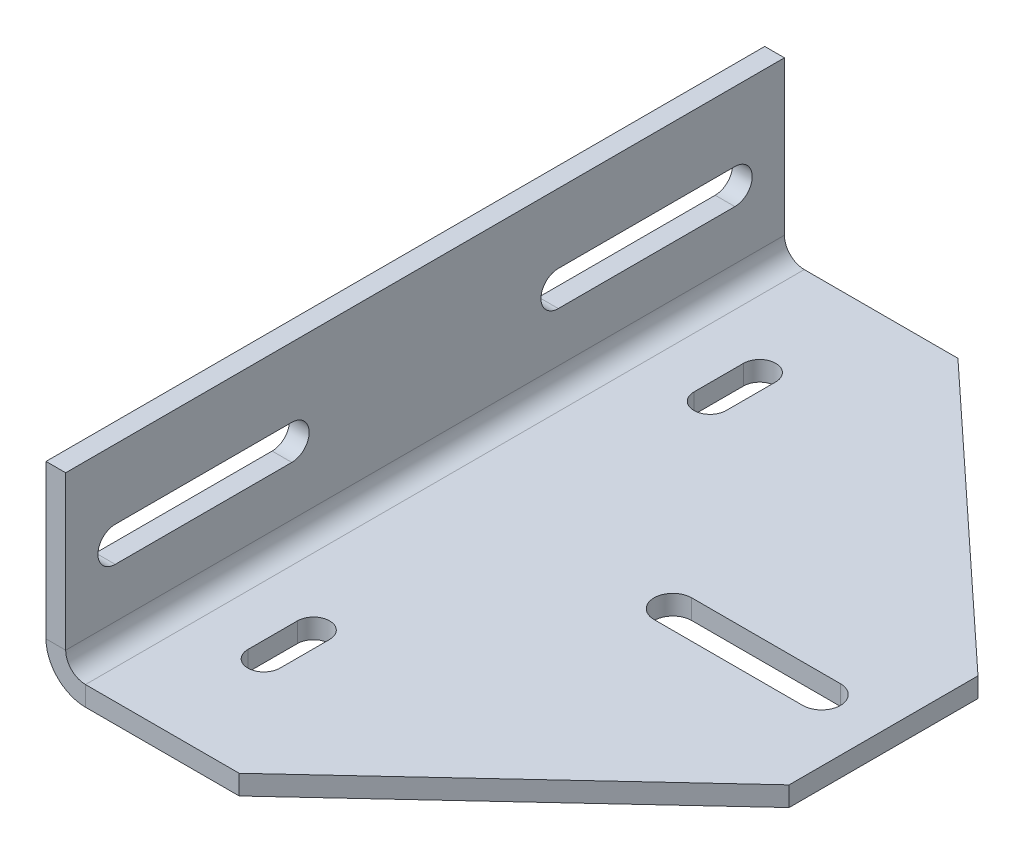
ISO-10303-21;
HEADER;
FILE_DESCRIPTION(('STEP AP214'),'2;1');
FILE_NAME('part.step','',(''),(''),'','','');
FILE_SCHEMA(('AUTOMOTIVE_DESIGN { 1 0 10303 214 1 1 1 1 }'));
ENDSEC;
DATA;
#1=APPLICATION_CONTEXT('core data for automotive mechanical design processes');
#2=APPLICATION_PROTOCOL_DEFINITION('international standard','automotive_design',2000,#1);
#3=PRODUCT_CONTEXT('',#1,'mechanical');
#4=PRODUCT('Part','Part','',(#3));
#5=PRODUCT_RELATED_PRODUCT_CATEGORY('part','',(#4));
#6=PRODUCT_DEFINITION_FORMATION('','',#4);
#7=PRODUCT_DEFINITION_CONTEXT('part definition',#1,'design');
#8=PRODUCT_DEFINITION('design','',#6,#7);
#9=PRODUCT_DEFINITION_SHAPE('','',#8);
#10=(LENGTH_UNIT() NAMED_UNIT(*) SI_UNIT(.MILLI.,.METRE.));
#11=(NAMED_UNIT(*) PLANE_ANGLE_UNIT() SI_UNIT($,.RADIAN.));
#12=(NAMED_UNIT(*) SI_UNIT($,.STERADIAN.) SOLID_ANGLE_UNIT());
#13=UNCERTAINTY_MEASURE_WITH_UNIT(LENGTH_MEASURE(1.E-05),#10,'distance_accuracy_value','');
#14=(GEOMETRIC_REPRESENTATION_CONTEXT(3) GLOBAL_UNCERTAINTY_ASSIGNED_CONTEXT((#13)) GLOBAL_UNIT_ASSIGNED_CONTEXT((#10,
#11,#12)) REPRESENTATION_CONTEXT('',''));
#15=CARTESIAN_POINT('',(0.,0.,0.));
#16=DIRECTION('',(0.,0.,1.));
#17=DIRECTION('',(1.,0.,0.));
#18=AXIS2_PLACEMENT_3D('',#15,#16,#17);
#19=CARTESIAN_POINT('',(-7.9375,49.9375,0.));
#20=DIRECTION('',(0.,1.,0.));
#21=DIRECTION('',(0.,0.,-1.));
#22=AXIS2_PLACEMENT_3D('',#19,#20,#21);
#23=PLANE('',#22);
#24=DIRECTION('',(-1.,0.,0.));
#25=VECTOR('',#24,1.);
#26=CARTESIAN_POINT('',(-7.9375,49.9375,53.7606549397505));
#27=LINE('',#26,#25);
#28=CARTESIAN_POINT('',(0.,49.9375,53.7606549397505));
#29=VERTEX_POINT('',#28);
#30=CARTESIAN_POINT('',(-7.9375,49.9375,53.7606549397505));
#31=VERTEX_POINT('',#30);
#32=EDGE_CURVE('E11',#29,#31,#27,.T.);
#33=ORIENTED_EDGE('',*,*,#32,.F.);
#34=DIRECTION('',(0.,0.,1.));
#35=VECTOR('',#34,1.);
#36=CARTESIAN_POINT('',(0.,49.9375,0.));
#37=LINE('',#36,#35);
#38=CARTESIAN_POINT('',(0.,49.9375,125.));
#39=VERTEX_POINT('',#38);
#40=EDGE_CURVE('E177',#39,#29,#37,.F.);
#41=ORIENTED_EDGE('',*,*,#40,.F.);
#42=DIRECTION('',(-1.,0.,0.));
#43=VECTOR('',#42,1.);
#44=CARTESIAN_POINT('',(-7.9375,49.9375,125.));
#45=LINE('',#44,#43);
#46=CARTESIAN_POINT('',(-7.9375,49.9375,125.));
#47=VERTEX_POINT('',#46);
#48=EDGE_CURVE('E51',#39,#47,#45,.T.);
#49=ORIENTED_EDGE('',*,*,#48,.T.);
#50=DIRECTION('',(0.,0.,-1.));
#51=VECTOR('',#50,1.);
#52=CARTESIAN_POINT('',(-7.9375,49.9375,0.));
#53=LINE('',#52,#51);
#54=EDGE_CURVE('E274',#47,#31,#53,.T.);
#55=ORIENTED_EDGE('',*,*,#54,.T.);
#56=EDGE_LOOP('',(#33,#41,#49,#55));
#57=FACE_BOUND('',#56,.T.);
#58=ADVANCED_FACE('F41',(#57),#23,.F.);
#59=CARTESIAN_POINT('',(-7.9375,42.9375,125.));
#60=DIRECTION('',(-1.,0.,0.));
#61=DIRECTION('',(0.,0.,1.));
#62=AXIS2_PLACEMENT_3D('',#59,#60,#61);
#63=CYLINDRICAL_SURFACE('',#62,6.99999999999997);
#64=ORIENTED_EDGE('',*,*,#48,.F.);
#65=CARTESIAN_POINT('',(0.,42.9375,125.));
#66=DIRECTION('',(-1.,0.,0.));
#67=DIRECTION('',(0.,0.,1.));
#68=AXIS2_PLACEMENT_3D('',#65,#66,#67);
#69=CIRCLE('',#68,6.99999999999997);
#70=CARTESIAN_POINT('',(0.,35.9375,125.));
#71=VERTEX_POINT('',#70);
#72=EDGE_CURVE('E190',#39,#71,#69,.F.);
#73=ORIENTED_EDGE('',*,*,#72,.T.);
#74=DIRECTION('',(-1.,0.,0.));
#75=VECTOR('',#74,1.);
#76=CARTESIAN_POINT('',(-7.9375,35.9375,125.));
#77=LINE('',#76,#75);
#78=CARTESIAN_POINT('',(-7.9375,35.9375,125.));
#79=VERTEX_POINT('',#78);
#80=EDGE_CURVE('E169',#71,#79,#77,.T.);
#81=ORIENTED_EDGE('',*,*,#80,.T.);
#82=CARTESIAN_POINT('',(-7.9375,42.9375,125.));
#83=DIRECTION('',(-1.,0.,0.));
#84=DIRECTION('',(0.,0.,1.));
#85=AXIS2_PLACEMENT_3D('',#82,#83,#84);
#86=CIRCLE('',#85,6.99999999999997);
#87=EDGE_CURVE('E282',#47,#79,#86,.F.);
#88=ORIENTED_EDGE('',*,*,#87,.F.);
#89=EDGE_LOOP('',(#64,#73,#81,#88));
#90=FACE_BOUND('',#89,.T.);
#91=ADVANCED_FACE('F284',(#90),#63,.F.);
#92=CARTESIAN_POINT('',(-7.9375,35.9374999999999,0.));
#93=DIRECTION('',(0.,1.,0.));
#94=DIRECTION('',(0.,0.,-1.));
#95=AXIS2_PLACEMENT_3D('',#92,#93,#94);
#96=PLANE('',#95);
#97=ORIENTED_EDGE('',*,*,#80,.F.);
#98=DIRECTION('',(0.,0.,1.));
#99=VECTOR('',#98,1.);
#100=CARTESIAN_POINT('',(0.,35.9375,0.));
#101=LINE('',#100,#99);
#102=CARTESIAN_POINT('',(0.,35.9375,53.7606549397505));
#103=VERTEX_POINT('',#102);
#104=EDGE_CURVE('E175',#71,#103,#101,.F.);
#105=ORIENTED_EDGE('',*,*,#104,.T.);
#106=DIRECTION('',(-1.,0.,0.));
#107=VECTOR('',#106,1.);
#108=CARTESIAN_POINT('',(-7.9375,35.9375,53.7606549397505));
#109=LINE('',#108,#107);
#110=CARTESIAN_POINT('',(-7.9375,35.9375,53.7606549397505));
#111=VERTEX_POINT('',#110);
#112=EDGE_CURVE('E45',#103,#111,#109,.T.);
#113=ORIENTED_EDGE('',*,*,#112,.T.);
#114=DIRECTION('',(0.,0.,-1.));
#115=VECTOR('',#114,1.);
#116=CARTESIAN_POINT('',(-7.9375,35.9374999999999,0.));
#117=LINE('',#116,#115);
#118=EDGE_CURVE('E539',#79,#111,#117,.T.);
#119=ORIENTED_EDGE('',*,*,#118,.F.);
#120=EDGE_LOOP('',(#97,#105,#113,#119));
#121=FACE_BOUND('',#120,.T.);
#122=ADVANCED_FACE('F179',(#121),#96,.T.);
#123=CARTESIAN_POINT('',(-7.9375,42.9375,-125.));
#124=DIRECTION('',(-1.,0.,0.));
#125=DIRECTION('',(0.,0.,1.));
#126=AXIS2_PLACEMENT_3D('',#123,#124,#125);
#127=CYLINDRICAL_SURFACE('',#126,6.99999999999997);
#128=DIRECTION('',(-1.,0.,0.));
#129=VECTOR('',#128,1.);
#130=CARTESIAN_POINT('',(-7.9375,35.9375,-125.));
#131=LINE('',#130,#129);
#132=CARTESIAN_POINT('',(0.,35.9375,-125.));
#133=VERTEX_POINT('',#132);
#134=CARTESIAN_POINT('',(-7.9375,35.9375,-125.));
#135=VERTEX_POINT('',#134);
#136=EDGE_CURVE('E170',#133,#135,#131,.T.);
#137=ORIENTED_EDGE('',*,*,#136,.F.);
#138=CARTESIAN_POINT('',(0.,42.9375,-125.));
#139=DIRECTION('',(-1.,0.,0.));
#140=DIRECTION('',(0.,0.,1.));
#141=AXIS2_PLACEMENT_3D('',#138,#139,#140);
#142=CIRCLE('',#141,6.99999999999997);
#143=CARTESIAN_POINT('',(0.,49.9375,-125.));
#144=VERTEX_POINT('',#143);
#145=EDGE_CURVE('E421',#144,#133,#142,.T.);
#146=ORIENTED_EDGE('',*,*,#145,.F.);
#147=DIRECTION('',(-1.,0.,0.));
#148=VECTOR('',#147,1.);
#149=CARTESIAN_POINT('',(-7.9375,49.9375,-125.));
#150=LINE('',#149,#148);
#151=CARTESIAN_POINT('',(-7.9375,49.9375,-125.));
#152=VERTEX_POINT('',#151);
#153=EDGE_CURVE('E262',#144,#152,#150,.T.);
#154=ORIENTED_EDGE('',*,*,#153,.T.);
#155=CARTESIAN_POINT('',(-7.9375,42.9375,-125.));
#156=DIRECTION('',(-1.,0.,0.));
#157=DIRECTION('',(0.,0.,1.));
#158=AXIS2_PLACEMENT_3D('',#155,#156,#157);
#159=CIRCLE('',#158,6.99999999999997);
#160=EDGE_CURVE('E544',#152,#135,#159,.T.);
#161=ORIENTED_EDGE('',*,*,#160,.T.);
#162=EDGE_LOOP('',(#137,#146,#154,#161));
#163=FACE_BOUND('',#162,.T.);
#164=ADVANCED_FACE('F556',(#163),#127,.F.);
#165=CARTESIAN_POINT('',(-7.9375,49.9375,0.));
#166=DIRECTION('',(0.,-1.,0.));
#167=DIRECTION('',(0.,0.,1.));
#168=AXIS2_PLACEMENT_3D('',#165,#166,#167);
#169=PLANE('',#168);
#170=ORIENTED_EDGE('',*,*,#153,.F.);
#171=DIRECTION('',(0.,0.,1.));
#172=VECTOR('',#171,1.);
#173=CARTESIAN_POINT('',(0.,49.9375,0.));
#174=LINE('',#173,#172);
#175=CARTESIAN_POINT('',(0.,49.9375,-53.7606549397505));
#176=VERTEX_POINT('',#175);
#177=EDGE_CURVE('E402',#144,#176,#174,.T.);
#178=ORIENTED_EDGE('',*,*,#177,.T.);
#179=DIRECTION('',(-1.,0.,0.));
#180=VECTOR('',#179,1.);
#181=CARTESIAN_POINT('',(-7.9375,49.9375,-53.7606549397505));
#182=LINE('',#181,#180);
#183=CARTESIAN_POINT('',(-7.9375,49.9375,-53.7606549397505));
#184=VERTEX_POINT('',#183);
#185=EDGE_CURVE('E259',#176,#184,#182,.T.);
#186=ORIENTED_EDGE('',*,*,#185,.T.);
#187=DIRECTION('',(0.,0.,1.));
#188=VECTOR('',#187,1.);
#189=CARTESIAN_POINT('',(-7.9375,49.9375,0.));
#190=LINE('',#189,#188);
#191=EDGE_CURVE('E441',#152,#184,#190,.T.);
#192=ORIENTED_EDGE('',*,*,#191,.F.);
#193=EDGE_LOOP('',(#170,#178,#186,#192));
#194=FACE_BOUND('',#193,.T.);
#195=ADVANCED_FACE('F439',(#194),#169,.T.);
#196=CARTESIAN_POINT('',(-7.9375,42.9375,-53.7606549397505));
#197=DIRECTION('',(-1.,0.,0.));
#198=DIRECTION('',(0.,0.,1.));
#199=AXIS2_PLACEMENT_3D('',#196,#197,#198);
#200=CYLINDRICAL_SURFACE('',#199,7.);
#201=ORIENTED_EDGE('',*,*,#185,.F.);
#202=CARTESIAN_POINT('',(0.,42.9375,-53.7606549397505));
#203=DIRECTION('',(-1.,0.,0.));
#204=DIRECTION('',(0.,0.,1.));
#205=AXIS2_PLACEMENT_3D('',#202,#203,#204);
#206=CIRCLE('',#205,7.);
#207=CARTESIAN_POINT('',(0.,35.9375,-53.7606549397505));
#208=VERTEX_POINT('',#207);
#209=EDGE_CURVE('E398',#208,#176,#206,.T.);
#210=ORIENTED_EDGE('',*,*,#209,.F.);
#211=DIRECTION('',(-1.,0.,0.));
#212=VECTOR('',#211,1.);
#213=CARTESIAN_POINT('',(-7.9375,35.9375,-53.7606549397505));
#214=LINE('',#213,#212);
#215=CARTESIAN_POINT('',(-7.9375,35.9375,-53.7606549397505));
#216=VERTEX_POINT('',#215);
#217=EDGE_CURVE('E256',#208,#216,#214,.T.);
#218=ORIENTED_EDGE('',*,*,#217,.T.);
#219=CARTESIAN_POINT('',(-7.9375,42.9375,-53.7606549397505));
#220=DIRECTION('',(-1.,0.,0.));
#221=DIRECTION('',(0.,0.,1.));
#222=AXIS2_PLACEMENT_3D('',#219,#220,#221);
#223=CIRCLE('',#222,7.);
#224=EDGE_CURVE('E350',#216,#184,#223,.T.);
#225=ORIENTED_EDGE('',*,*,#224,.T.);
#226=EDGE_LOOP('',(#201,#210,#218,#225));
#227=FACE_BOUND('',#226,.T.);
#228=ADVANCED_FACE('F432',(#227),#200,.F.);
#229=CARTESIAN_POINT('',(28.5,0.,0.));
#230=DIRECTION('',(-1.,0.,0.));
#231=DIRECTION('',(0.,0.,1.));
#232=AXIS2_PLACEMENT_3D('',#229,#230,#231);
#233=PLANE('',#232);
#234=DIRECTION('',(0.,-1.,0.));
#235=VECTOR('',#234,1.);
#236=CARTESIAN_POINT('',(28.5,0.,-100.));
#237=LINE('',#236,#235);
#238=CARTESIAN_POINT('',(28.5,7.9375,-100.));
#239=VERTEX_POINT('',#238);
#240=CARTESIAN_POINT('',(28.5,0.,-100.));
#241=VERTEX_POINT('',#240);
#242=EDGE_CURVE('E253',#239,#241,#237,.T.);
#243=ORIENTED_EDGE('',*,*,#242,.F.);
#244=DIRECTION('',(0.,0.,1.));
#245=VECTOR('',#244,1.);
#246=CARTESIAN_POINT('',(28.5,7.9375,0.));
#247=LINE('',#246,#245);
#248=CARTESIAN_POINT('',(28.5,7.9375,-80.));
#249=VERTEX_POINT('',#248);
#250=EDGE_CURVE('E413',#239,#249,#247,.T.);
#251=ORIENTED_EDGE('',*,*,#250,.T.);
#252=DIRECTION('',(0.,-1.,0.));
#253=VECTOR('',#252,1.);
#254=CARTESIAN_POINT('',(28.5,0.,-80.));
#255=LINE('',#254,#253);
#256=CARTESIAN_POINT('',(28.5,0.,-80.));
#257=VERTEX_POINT('',#256);
#258=EDGE_CURVE('E250',#249,#257,#255,.T.);
#259=ORIENTED_EDGE('',*,*,#258,.T.);
#260=DIRECTION('',(0.,0.,1.));
#261=VECTOR('',#260,1.);
#262=CARTESIAN_POINT('',(28.5,0.,0.));
#263=LINE('',#262,#261);
#264=EDGE_CURVE('E333',#241,#257,#263,.T.);
#265=ORIENTED_EDGE('',*,*,#264,.F.);
#266=EDGE_LOOP('',(#243,#251,#259,#265));
#267=FACE_BOUND('',#266,.T.);
#268=ADVANCED_FACE('F648',(#267),#233,.F.);
#269=CARTESIAN_POINT('',(35.,0.,-80.));
#270=DIRECTION('',(0.,1.,0.));
#271=DIRECTION('',(0.,0.,1.));
#272=AXIS2_PLACEMENT_3D('',#269,#270,#271);
#273=CYLINDRICAL_SURFACE('',#272,6.49999999999998);
#274=ORIENTED_EDGE('',*,*,#258,.F.);
#275=CARTESIAN_POINT('',(35.,7.9375,-80.));
#276=DIRECTION('',(0.,1.,0.));
#277=DIRECTION('',(0.,0.,1.));
#278=AXIS2_PLACEMENT_3D('',#275,#276,#277);
#279=CIRCLE('',#278,6.49999999999998);
#280=CARTESIAN_POINT('',(41.5,7.9375,-80.));
#281=VERTEX_POINT('',#280);
#282=EDGE_CURVE('E356',#281,#249,#279,.F.);
#283=ORIENTED_EDGE('',*,*,#282,.F.);
#284=DIRECTION('',(0.,-1.,0.));
#285=VECTOR('',#284,1.);
#286=CARTESIAN_POINT('',(41.5,0.,-80.));
#287=LINE('',#286,#285);
#288=CARTESIAN_POINT('',(41.5,0.,-80.));
#289=VERTEX_POINT('',#288);
#290=EDGE_CURVE('E247',#281,#289,#287,.T.);
#291=ORIENTED_EDGE('',*,*,#290,.T.);
#292=CARTESIAN_POINT('',(35.,0.,-80.));
#293=DIRECTION('',(0.,1.,0.));
#294=DIRECTION('',(0.,0.,1.));
#295=AXIS2_PLACEMENT_3D('',#292,#293,#294);
#296=CIRCLE('',#295,6.49999999999998);
#297=EDGE_CURVE('E336',#289,#257,#296,.F.);
#298=ORIENTED_EDGE('',*,*,#297,.T.);
#299=EDGE_LOOP('',(#274,#283,#291,#298));
#300=FACE_BOUND('',#299,.T.);
#301=ADVANCED_FACE('F644',(#300),#273,.F.);
#302=CARTESIAN_POINT('',(41.5,0.,0.));
#303=DIRECTION('',(-1.,0.,0.));
#304=DIRECTION('',(0.,0.,1.));
#305=AXIS2_PLACEMENT_3D('',#302,#303,#304);
#306=PLANE('',#305);
#307=ORIENTED_EDGE('',*,*,#290,.F.);
#308=DIRECTION('',(0.,0.,1.));
#309=VECTOR('',#308,1.);
#310=CARTESIAN_POINT('',(41.5,7.9375,0.));
#311=LINE('',#310,#309);
#312=CARTESIAN_POINT('',(41.5,7.9375,-100.));
#313=VERTEX_POINT('',#312);
#314=EDGE_CURVE('E387',#313,#281,#311,.T.);
#315=ORIENTED_EDGE('',*,*,#314,.F.);
#316=DIRECTION('',(0.,-1.,0.));
#317=VECTOR('',#316,1.);
#318=CARTESIAN_POINT('',(41.5,0.,-100.));
#319=LINE('',#318,#317);
#320=CARTESIAN_POINT('',(41.5,0.,-100.));
#321=VERTEX_POINT('',#320);
#322=EDGE_CURVE('E245',#313,#321,#319,.T.);
#323=ORIENTED_EDGE('',*,*,#322,.T.);
#324=DIRECTION('',(0.,0.,1.));
#325=VECTOR('',#324,1.);
#326=CARTESIAN_POINT('',(41.5,0.,0.));
#327=LINE('',#326,#325);
#328=EDGE_CURVE('E327',#321,#289,#327,.T.);
#329=ORIENTED_EDGE('',*,*,#328,.T.);
#330=EDGE_LOOP('',(#307,#315,#323,#329));
#331=FACE_BOUND('',#330,.T.);
#332=ADVANCED_FACE('F638',(#331),#306,.T.);
#333=CARTESIAN_POINT('',(-7.9375,0.,145.));
#334=DIRECTION('',(0.,0.,1.));
#335=DIRECTION('',(0.,1.,0.));
#336=AXIS2_PLACEMENT_3D('',#333,#334,#335);
#337=PLANE('',#336);
#338=DIRECTION('',(-1.,0.,0.));
#339=VECTOR('',#338,1.);
#340=CARTESIAN_POINT('',(-7.9375,15.9375,145.));
#341=LINE('',#340,#339);
#342=CARTESIAN_POINT('',(0.,15.9375,145.));
#343=VERTEX_POINT('',#342);
#344=CARTESIAN_POINT('',(-7.9375,15.9375,145.));
#345=VERTEX_POINT('',#344);
#346=EDGE_CURVE('E242',#343,#345,#341,.T.);
#347=ORIENTED_EDGE('',*,*,#346,.F.);
#348=DIRECTION('',(0.,1.,0.));
#349=VECTOR('',#348,1.);
#350=CARTESIAN_POINT('',(0.,0.,145.));
#351=LINE('',#350,#349);
#352=CARTESIAN_POINT('',(0.,77.9375,145.));
#353=VERTEX_POINT('',#352);
#354=EDGE_CURVE('E184',#343,#353,#351,.T.);
#355=ORIENTED_EDGE('',*,*,#354,.T.);
#356=DIRECTION('',(-1.,0.,0.));
#357=VECTOR('',#356,1.);
#358=CARTESIAN_POINT('',(-7.9375,77.9375,145.));
#359=LINE('',#358,#357);
#360=CARTESIAN_POINT('',(-7.9375,77.9375,145.));
#361=VERTEX_POINT('',#360);
#362=EDGE_CURVE('E239',#353,#361,#359,.T.);
#363=ORIENTED_EDGE('',*,*,#362,.T.);
#364=DIRECTION('',(0.,1.,0.));
#365=VECTOR('',#364,1.);
#366=CARTESIAN_POINT('',(-7.9375,0.,145.));
#367=LINE('',#366,#365);
#368=EDGE_CURVE('E498',#345,#361,#367,.T.);
#369=ORIENTED_EDGE('',*,*,#368,.F.);
#370=EDGE_LOOP('',(#347,#355,#363,#369));
#371=FACE_BOUND('',#370,.T.);
#372=ADVANCED_FACE('F499',(#371),#337,.T.);
#373=CARTESIAN_POINT('',(-7.9375,77.9375,0.));
#374=DIRECTION('',(0.,-1.,0.));
#375=DIRECTION('',(0.,0.,1.));
#376=AXIS2_PLACEMENT_3D('',#373,#374,#375);
#377=PLANE('',#376);
#378=ORIENTED_EDGE('',*,*,#362,.F.);
#379=DIRECTION('',(0.,0.,1.));
#380=VECTOR('',#379,1.);
#381=CARTESIAN_POINT('',(0.,77.9375,0.));
#382=LINE('',#381,#380);
#383=CARTESIAN_POINT('',(0.,77.9375,-145.));
#384=VERTEX_POINT('',#383);
#385=EDGE_CURVE('E181',#384,#353,#382,.T.);
#386=ORIENTED_EDGE('',*,*,#385,.F.);
#387=DIRECTION('',(-1.,0.,0.));
#388=VECTOR('',#387,1.);
#389=CARTESIAN_POINT('',(-7.9375,77.9375,-145.));
#390=LINE('',#389,#388);
#391=CARTESIAN_POINT('',(-7.9375,77.9375,-145.));
#392=VERTEX_POINT('',#391);
#393=EDGE_CURVE('E236',#384,#392,#390,.T.);
#394=ORIENTED_EDGE('',*,*,#393,.T.);
#395=DIRECTION('',(0.,0.,1.));
#396=VECTOR('',#395,1.);
#397=CARTESIAN_POINT('',(-7.9375,77.9375,0.));
#398=LINE('',#397,#396);
#399=EDGE_CURVE('E503',#392,#361,#398,.T.);
#400=ORIENTED_EDGE('',*,*,#399,.T.);
#401=EDGE_LOOP('',(#378,#386,#394,#400));
#402=FACE_BOUND('',#401,.T.);
#403=ADVANCED_FACE('F538',(#402),#377,.F.);
#404=CARTESIAN_POINT('',(-7.9375,0.,-145.));
#405=DIRECTION('',(0.,0.,1.));
#406=DIRECTION('',(0.,1.,0.));
#407=AXIS2_PLACEMENT_3D('',#404,#405,#406);
#408=PLANE('',#407);
#409=ORIENTED_EDGE('',*,*,#393,.F.);
#410=DIRECTION('',(0.,1.,0.));
#411=VECTOR('',#410,1.);
#412=CARTESIAN_POINT('',(0.,0.,-145.));
#413=LINE('',#412,#411);
#414=CARTESIAN_POINT('',(0.,15.9375,-145.));
#415=VERTEX_POINT('',#414);
#416=EDGE_CURVE('E400',#415,#384,#413,.T.);
#417=ORIENTED_EDGE('',*,*,#416,.F.);
#418=DIRECTION('',(-1.,0.,0.));
#419=VECTOR('',#418,1.);
#420=CARTESIAN_POINT('',(-7.9375,15.9375,-145.));
#421=LINE('',#420,#419);
#422=CARTESIAN_POINT('',(-7.9375,15.9375,-145.));
#423=VERTEX_POINT('',#422);
#424=EDGE_CURVE('E233',#415,#423,#421,.T.);
#425=ORIENTED_EDGE('',*,*,#424,.T.);
#426=DIRECTION('',(0.,1.,0.));
#427=VECTOR('',#426,1.);
#428=CARTESIAN_POINT('',(-7.9375,0.,-145.));
#429=LINE('',#428,#427);
#430=EDGE_CURVE('E504',#423,#392,#429,.T.);
#431=ORIENTED_EDGE('',*,*,#430,.T.);
#432=EDGE_LOOP('',(#409,#417,#425,#431));
#433=FACE_BOUND('',#432,.T.);
#434=ADVANCED_FACE('F631',(#433),#408,.F.);
#435=CARTESIAN_POINT('',(8.,15.9375,-145.));
#436=DIRECTION('',(0.,0.,-1.));
#437=DIRECTION('',(-1.,0.,0.));
#438=AXIS2_PLACEMENT_3D('',#435,#436,#437);
#439=PLANE('',#438);
#440=ORIENTED_EDGE('',*,*,#424,.F.);
#441=CARTESIAN_POINT('',(8.,15.9375,-145.));
#442=DIRECTION('',(0.,0.,-1.));
#443=DIRECTION('',(-1.,0.,0.));
#444=AXIS2_PLACEMENT_3D('',#441,#442,#443);
#445=CIRCLE('',#444,8.);
#446=CARTESIAN_POINT('',(8.,7.9375,-145.));
#447=VERTEX_POINT('',#446);
#448=EDGE_CURVE('E396',#415,#447,#445,.F.);
#449=ORIENTED_EDGE('',*,*,#448,.T.);
#450=DIRECTION('',(0.,-1.,0.));
#451=VECTOR('',#450,1.);
#452=CARTESIAN_POINT('',(8.,0.,-145.));
#453=LINE('',#452,#451);
#454=CARTESIAN_POINT('',(8.,0.,-145.));
#455=VERTEX_POINT('',#454);
#456=EDGE_CURVE('E59',#447,#455,#453,.T.);
#457=ORIENTED_EDGE('',*,*,#456,.T.);
#458=CARTESIAN_POINT('',(8.,15.9375,-145.));
#459=DIRECTION('',(0.,0.,1.));
#460=DIRECTION('',(1.,0.,0.));
#461=AXIS2_PLACEMENT_3D('',#458,#459,#460);
#462=CIRCLE('',#461,15.9375);
#463=EDGE_CURVE('E347',#423,#455,#462,.T.);
#464=ORIENTED_EDGE('',*,*,#463,.F.);
#465=EDGE_LOOP('',(#440,#449,#457,#464));
#466=FACE_BOUND('',#465,.T.);
#467=ADVANCED_FACE('F510',(#466),#439,.T.);
#468=CARTESIAN_POINT('',(0.,0.,-145.));
#469=DIRECTION('',(0.,0.,1.));
#470=DIRECTION('',(1.,0.,0.));
#471=AXIS2_PLACEMENT_3D('',#468,#469,#470);
#472=PLANE('',#471);
#473=ORIENTED_EDGE('',*,*,#456,.F.);
#474=DIRECTION('',(1.,0.,0.));
#475=VECTOR('',#474,1.);
#476=CARTESIAN_POINT('',(0.,7.9375,-145.));
#477=LINE('',#476,#475);
#478=CARTESIAN_POINT('',(70.,7.9375,-145.));
#479=VERTEX_POINT('',#478);
#480=EDGE_CURVE('E383',#447,#479,#477,.T.);
#481=ORIENTED_EDGE('',*,*,#480,.T.);
#482=DIRECTION('',(0.,-1.,0.));
#483=VECTOR('',#482,1.);
#484=CARTESIAN_POINT('',(70.,0.,-145.));
#485=LINE('',#484,#483);
#486=CARTESIAN_POINT('',(70.,0.,-145.));
#487=VERTEX_POINT('',#486);
#488=EDGE_CURVE('E229',#479,#487,#485,.T.);
#489=ORIENTED_EDGE('',*,*,#488,.T.);
#490=DIRECTION('',(1.,0.,0.));
#491=VECTOR('',#490,1.);
#492=CARTESIAN_POINT('',(0.,0.,-145.));
#493=LINE('',#492,#491);
#494=EDGE_CURVE('E315',#455,#487,#493,.T.);
#495=ORIENTED_EDGE('',*,*,#494,.F.);
#496=EDGE_LOOP('',(#473,#481,#489,#495));
#497=FACE_BOUND('',#496,.T.);
#498=ADVANCED_FACE('F514',(#497),#472,.F.);
#499=CARTESIAN_POINT('',(104.755244982174,0.,-112.692733142657));
#500=DIRECTION('',(-0.680841864798835,0.,0.732430443890234));
#501=DIRECTION('',(0.732430443890234,0.,0.680841864798835));
#502=AXIS2_PLACEMENT_3D('',#499,#500,#501);
#503=PLANE('',#502);
#504=ORIENTED_EDGE('',*,*,#488,.F.);
#505=DIRECTION('',(0.732430443890234,0.,0.680841864798835));
#506=VECTOR('',#505,1.);
#507=CARTESIAN_POINT('',(104.755244982174,7.9375,-112.692733142657));
#508=LINE('',#507,#506);
#509=CARTESIAN_POINT('',(185.,7.9375,-38.1));
#510=VERTEX_POINT('',#509);
#511=EDGE_CURVE('E391',#479,#510,#508,.T.);
#512=ORIENTED_EDGE('',*,*,#511,.T.);
#513=DIRECTION('',(0.,-1.,0.));
#514=VECTOR('',#513,1.);
#515=CARTESIAN_POINT('',(185.,0.,-38.1));
#516=LINE('',#515,#514);
#517=CARTESIAN_POINT('',(185.,0.,-38.1));
#518=VERTEX_POINT('',#517);
#519=EDGE_CURVE('E226',#510,#518,#516,.T.);
#520=ORIENTED_EDGE('',*,*,#519,.T.);
#521=DIRECTION('',(0.732430443890234,0.,0.680841864798835));
#522=VECTOR('',#521,1.);
#523=CARTESIAN_POINT('',(104.755244982174,0.,-112.692733142657));
#524=LINE('',#523,#522);
#525=EDGE_CURVE('E318',#487,#518,#524,.T.);
#526=ORIENTED_EDGE('',*,*,#525,.F.);
#527=EDGE_LOOP('',(#504,#512,#520,#526));
#528=FACE_BOUND('',#527,.T.);
#529=ADVANCED_FACE('F622',(#528),#503,.F.);
#530=CARTESIAN_POINT('',(185.,0.,0.));
#531=DIRECTION('',(-1.,0.,0.));
#532=DIRECTION('',(0.,0.,1.));
#533=AXIS2_PLACEMENT_3D('',#530,#531,#532);
#534=PLANE('',#533);
#535=ORIENTED_EDGE('',*,*,#519,.F.);
#536=DIRECTION('',(0.,0.,1.));
#537=VECTOR('',#536,1.);
#538=CARTESIAN_POINT('',(185.,7.9375,0.));
#539=LINE('',#538,#537);
#540=CARTESIAN_POINT('',(185.,7.9375,38.1));
#541=VERTEX_POINT('',#540);
#542=EDGE_CURVE('E388',#510,#541,#539,.T.);
#543=ORIENTED_EDGE('',*,*,#542,.T.);
#544=DIRECTION('',(0.,-1.,0.));
#545=VECTOR('',#544,1.);
#546=CARTESIAN_POINT('',(185.,0.,38.1));
#547=LINE('',#546,#545);
#548=CARTESIAN_POINT('',(185.,0.,38.1));
#549=VERTEX_POINT('',#548);
#550=EDGE_CURVE('E223',#541,#549,#547,.T.);
#551=ORIENTED_EDGE('',*,*,#550,.T.);
#552=DIRECTION('',(0.,0.,1.));
#553=VECTOR('',#552,1.);
#554=CARTESIAN_POINT('',(185.,0.,0.));
#555=LINE('',#554,#553);
#556=EDGE_CURVE('E321',#518,#549,#555,.T.);
#557=ORIENTED_EDGE('',*,*,#556,.F.);
#558=EDGE_LOOP('',(#535,#543,#551,#557));
#559=FACE_BOUND('',#558,.T.);
#560=ADVANCED_FACE('F618',(#559),#534,.F.);
#561=CARTESIAN_POINT('',(104.755244982174,0.,112.692733142657));
#562=DIRECTION('',(-0.680841864798835,0.,-0.732430443890234));
#563=DIRECTION('',(-0.732430443890234,0.,0.680841864798835));
#564=AXIS2_PLACEMENT_3D('',#561,#562,#563);
#565=PLANE('',#564);
#566=ORIENTED_EDGE('',*,*,#550,.F.);
#567=DIRECTION('',(-0.732430443890234,0.,0.680841864798835));
#568=VECTOR('',#567,1.);
#569=CARTESIAN_POINT('',(104.755244982174,7.9375,112.692733142657));
#570=LINE('',#569,#568);
#571=CARTESIAN_POINT('',(70.,7.9375,145.));
#572=VERTEX_POINT('',#571);
#573=EDGE_CURVE('E384',#541,#572,#570,.T.);
#574=ORIENTED_EDGE('',*,*,#573,.T.);
#575=DIRECTION('',(0.,-1.,0.));
#576=VECTOR('',#575,1.);
#577=CARTESIAN_POINT('',(70.,0.,145.));
#578=LINE('',#577,#576);
#579=CARTESIAN_POINT('',(70.,0.,145.));
#580=VERTEX_POINT('',#579);
#581=EDGE_CURVE('E220',#572,#580,#578,.T.);
#582=ORIENTED_EDGE('',*,*,#581,.T.);
#583=DIRECTION('',(-0.732430443890234,0.,0.680841864798835));
#584=VECTOR('',#583,1.);
#585=CARTESIAN_POINT('',(104.755244982174,0.,112.692733142657));
#586=LINE('',#585,#584);
#587=EDGE_CURVE('E324',#549,#580,#586,.T.);
#588=ORIENTED_EDGE('',*,*,#587,.F.);
#589=EDGE_LOOP('',(#566,#574,#582,#588));
#590=FACE_BOUND('',#589,.T.);
#591=ADVANCED_FACE('F615',(#590),#565,.F.);
#592=CARTESIAN_POINT('',(0.,0.,145.));
#593=DIRECTION('',(0.,0.,-1.));
#594=DIRECTION('',(-1.,0.,0.));
#595=AXIS2_PLACEMENT_3D('',#592,#593,#594);
#596=PLANE('',#595);
#597=ORIENTED_EDGE('',*,*,#581,.F.);
#598=DIRECTION('',(1.,0.,0.));
#599=VECTOR('',#598,1.);
#600=CARTESIAN_POINT('',(0.,7.9375,145.));
#601=LINE('',#600,#599);
#602=CARTESIAN_POINT('',(8.,7.9375,145.));
#603=VERTEX_POINT('',#602);
#604=EDGE_CURVE('E375',#572,#603,#601,.F.);
#605=ORIENTED_EDGE('',*,*,#604,.T.);
#606=DIRECTION('',(0.,-1.,0.));
#607=VECTOR('',#606,1.);
#608=CARTESIAN_POINT('',(8.,0.,145.));
#609=LINE('',#608,#607);
#610=CARTESIAN_POINT('',(8.,0.,145.));
#611=VERTEX_POINT('',#610);
#612=EDGE_CURVE('E217',#603,#611,#609,.T.);
#613=ORIENTED_EDGE('',*,*,#612,.T.);
#614=DIRECTION('',(-1.,0.,0.));
#615=VECTOR('',#614,1.);
#616=CARTESIAN_POINT('',(0.,0.,145.));
#617=LINE('',#616,#615);
#618=EDGE_CURVE('E312',#580,#611,#617,.T.);
#619=ORIENTED_EDGE('',*,*,#618,.F.);
#620=EDGE_LOOP('',(#597,#605,#613,#619));
#621=FACE_BOUND('',#620,.T.);
#622=ADVANCED_FACE('F522',(#621),#596,.F.);
#623=CARTESIAN_POINT('',(100.,0.,0.));
#624=DIRECTION('',(0.,1.,0.));
#625=DIRECTION('',(0.,0.,1.));
#626=AXIS2_PLACEMENT_3D('',#623,#624,#625);
#627=CYLINDRICAL_SURFACE('',#626,7.59792299646783);
#628=DIRECTION('',(0.,-1.,0.));
#629=VECTOR('',#628,1.);
#630=CARTESIAN_POINT('',(100.,0.,-7.59792299646783));
#631=LINE('',#630,#629);
#632=CARTESIAN_POINT('',(100.,7.9375,-7.59792299646783));
#633=VERTEX_POINT('',#632);
#634=CARTESIAN_POINT('',(100.,0.,-7.59792299646783));
#635=VERTEX_POINT('',#634);
#636=EDGE_CURVE('E214',#633,#635,#631,.T.);
#637=ORIENTED_EDGE('',*,*,#636,.F.);
#638=CARTESIAN_POINT('',(100.,7.9375,0.));
#639=DIRECTION('',(0.,1.,0.));
#640=DIRECTION('',(0.,0.,1.));
#641=AXIS2_PLACEMENT_3D('',#638,#639,#640);
#642=CIRCLE('',#641,7.59792299646783);
#643=CARTESIAN_POINT('',(100.,7.9375,7.59792299646783));
#644=VERTEX_POINT('',#643);
#645=EDGE_CURVE('E376',#633,#644,#642,.T.);
#646=ORIENTED_EDGE('',*,*,#645,.T.);
#647=DIRECTION('',(0.,-1.,0.));
#648=VECTOR('',#647,1.);
#649=CARTESIAN_POINT('',(100.,0.,7.59792299646783));
#650=LINE('',#649,#648);
#651=CARTESIAN_POINT('',(100.,0.,7.59792299646783));
#652=VERTEX_POINT('',#651);
#653=EDGE_CURVE('E211',#644,#652,#650,.T.);
#654=ORIENTED_EDGE('',*,*,#653,.T.);
#655=CARTESIAN_POINT('',(100.,0.,0.));
#656=DIRECTION('',(0.,1.,0.));
#657=DIRECTION('',(0.,0.,1.));
#658=AXIS2_PLACEMENT_3D('',#655,#656,#657);
#659=CIRCLE('',#658,7.59792299646783);
#660=EDGE_CURVE('E306',#635,#652,#659,.T.);
#661=ORIENTED_EDGE('',*,*,#660,.F.);
#662=EDGE_LOOP('',(#637,#646,#654,#661));
#663=FACE_BOUND('',#662,.T.);
#664=ADVANCED_FACE('F605',(#663),#627,.F.);
#665=CARTESIAN_POINT('',(0.,0.,7.59792299646783));
#666=DIRECTION('',(0.,0.,1.));
#667=DIRECTION('',(1.,0.,0.));
#668=AXIS2_PLACEMENT_3D('',#665,#666,#667);
#669=PLANE('',#668);
#670=ORIENTED_EDGE('',*,*,#653,.F.);
#671=DIRECTION('',(1.,0.,0.));
#672=VECTOR('',#671,1.);
#673=CARTESIAN_POINT('',(0.,7.9375,7.59792299646783));
#674=LINE('',#673,#672);
#675=CARTESIAN_POINT('',(160.,7.9375,7.59792299646783));
#676=VERTEX_POINT('',#675);
#677=EDGE_CURVE('E372',#644,#676,#674,.T.);
#678=ORIENTED_EDGE('',*,*,#677,.T.);
#679=DIRECTION('',(0.,-1.,0.));
#680=VECTOR('',#679,1.);
#681=CARTESIAN_POINT('',(160.,0.,7.59792299646783));
#682=LINE('',#681,#680);
#683=CARTESIAN_POINT('',(160.,0.,7.59792299646783));
#684=VERTEX_POINT('',#683);
#685=EDGE_CURVE('E208',#676,#684,#682,.T.);
#686=ORIENTED_EDGE('',*,*,#685,.T.);
#687=DIRECTION('',(1.,0.,0.));
#688=VECTOR('',#687,1.);
#689=CARTESIAN_POINT('',(0.,0.,7.59792299646783));
#690=LINE('',#689,#688);
#691=EDGE_CURVE('E309',#652,#684,#690,.T.);
#692=ORIENTED_EDGE('',*,*,#691,.F.);
#693=EDGE_LOOP('',(#670,#678,#686,#692));
#694=FACE_BOUND('',#693,.T.);
#695=ADVANCED_FACE('F601',(#694),#669,.F.);
#696=CARTESIAN_POINT('',(160.,0.,0.));
#697=DIRECTION('',(0.,1.,0.));
#698=DIRECTION('',(0.,0.,1.));
#699=AXIS2_PLACEMENT_3D('',#696,#697,#698);
#700=CYLINDRICAL_SURFACE('',#699,7.59792299646783);
#701=ORIENTED_EDGE('',*,*,#685,.F.);
#702=CARTESIAN_POINT('',(160.,7.9375,0.));
#703=DIRECTION('',(0.,1.,0.));
#704=DIRECTION('',(0.,0.,1.));
#705=AXIS2_PLACEMENT_3D('',#702,#703,#704);
#706=CIRCLE('',#705,7.59792299646783);
#707=CARTESIAN_POINT('',(160.,7.9375,-7.59792299646783));
#708=VERTEX_POINT('',#707);
#709=EDGE_CURVE('E363',#676,#708,#706,.T.);
#710=ORIENTED_EDGE('',*,*,#709,.T.);
#711=DIRECTION('',(0.,-1.,0.));
#712=VECTOR('',#711,1.);
#713=CARTESIAN_POINT('',(160.,0.,-7.59792299646783));
#714=LINE('',#713,#712);
#715=CARTESIAN_POINT('',(160.,0.,-7.59792299646783));
#716=VERTEX_POINT('',#715);
#717=EDGE_CURVE('E204',#708,#716,#714,.T.);
#718=ORIENTED_EDGE('',*,*,#717,.T.);
#719=CARTESIAN_POINT('',(160.,0.,0.));
#720=DIRECTION('',(0.,1.,0.));
#721=DIRECTION('',(0.,0.,1.));
#722=AXIS2_PLACEMENT_3D('',#719,#720,#721);
#723=CIRCLE('',#722,7.59792299646783);
#724=EDGE_CURVE('E300',#684,#716,#723,.T.);
#725=ORIENTED_EDGE('',*,*,#724,.F.);
#726=EDGE_LOOP('',(#701,#710,#718,#725));
#727=FACE_BOUND('',#726,.T.);
#728=ADVANCED_FACE('F593',(#727),#700,.F.);
#729=CARTESIAN_POINT('',(35.,0.,100.));
#730=DIRECTION('',(0.,1.,0.));
#731=DIRECTION('',(0.,0.,1.));
#732=AXIS2_PLACEMENT_3D('',#729,#730,#731);
#733=CYLINDRICAL_SURFACE('',#732,6.49999999999998);
#734=DIRECTION('',(0.,-1.,0.));
#735=VECTOR('',#734,1.);
#736=CARTESIAN_POINT('',(28.5,0.,100.));
#737=LINE('',#736,#735);
#738=CARTESIAN_POINT('',(28.5,7.9375,100.));
#739=VERTEX_POINT('',#738);
#740=CARTESIAN_POINT('',(28.5,0.,100.));
#741=VERTEX_POINT('',#740);
#742=EDGE_CURVE('E201',#739,#741,#737,.T.);
#743=ORIENTED_EDGE('',*,*,#742,.F.);
#744=CARTESIAN_POINT('',(35.,7.9375,100.));
#745=DIRECTION('',(0.,1.,0.));
#746=DIRECTION('',(0.,0.,1.));
#747=AXIS2_PLACEMENT_3D('',#744,#745,#746);
#748=CIRCLE('',#747,6.49999999999998);
#749=CARTESIAN_POINT('',(41.5,7.9375,100.));
#750=VERTEX_POINT('',#749);
#751=EDGE_CURVE('E364',#739,#750,#748,.T.);
#752=ORIENTED_EDGE('',*,*,#751,.T.);
#753=DIRECTION('',(0.,-1.,0.));
#754=VECTOR('',#753,1.);
#755=CARTESIAN_POINT('',(41.5,0.,100.));
#756=LINE('',#755,#754);
#757=CARTESIAN_POINT('',(41.5,0.,100.));
#758=VERTEX_POINT('',#757);
#759=EDGE_CURVE('E197',#750,#758,#756,.T.);
#760=ORIENTED_EDGE('',*,*,#759,.T.);
#761=CARTESIAN_POINT('',(35.,0.,100.));
#762=DIRECTION('',(0.,1.,0.));
#763=DIRECTION('',(0.,0.,1.));
#764=AXIS2_PLACEMENT_3D('',#761,#762,#763);
#765=CIRCLE('',#764,6.49999999999998);
#766=EDGE_CURVE('E294',#741,#758,#765,.T.);
#767=ORIENTED_EDGE('',*,*,#766,.F.);
#768=EDGE_LOOP('',(#743,#752,#760,#767));
#769=FACE_BOUND('',#768,.T.);
#770=ADVANCED_FACE('F585',(#769),#733,.F.);
#771=CARTESIAN_POINT('',(41.5,0.,0.));
#772=DIRECTION('',(1.,0.,0.));
#773=DIRECTION('',(0.,0.,-1.));
#774=AXIS2_PLACEMENT_3D('',#771,#772,#773);
#775=PLANE('',#774);
#776=ORIENTED_EDGE('',*,*,#759,.F.);
#777=DIRECTION('',(0.,0.,1.));
#778=VECTOR('',#777,1.);
#779=CARTESIAN_POINT('',(41.5,7.9375,0.));
#780=LINE('',#779,#778);
#781=CARTESIAN_POINT('',(41.5,7.9375,80.));
#782=VERTEX_POINT('',#781);
#783=EDGE_CURVE('E360',#750,#782,#780,.F.);
#784=ORIENTED_EDGE('',*,*,#783,.T.);
#785=DIRECTION('',(0.,-1.,0.));
#786=VECTOR('',#785,1.);
#787=CARTESIAN_POINT('',(41.5,0.,80.));
#788=LINE('',#787,#786);
#789=CARTESIAN_POINT('',(41.5,0.,80.));
#790=VERTEX_POINT('',#789);
#791=EDGE_CURVE('E194',#782,#790,#788,.T.);
#792=ORIENTED_EDGE('',*,*,#791,.T.);
#793=DIRECTION('',(0.,0.,-1.));
#794=VECTOR('',#793,1.);
#795=CARTESIAN_POINT('',(41.5,0.,0.));
#796=LINE('',#795,#794);
#797=EDGE_CURVE('E297',#758,#790,#796,.T.);
#798=ORIENTED_EDGE('',*,*,#797,.F.);
#799=EDGE_LOOP('',(#776,#784,#792,#798));
#800=FACE_BOUND('',#799,.T.);
#801=ADVANCED_FACE('F579',(#800),#775,.F.);
#802=CARTESIAN_POINT('',(35.,0.,80.));
#803=DIRECTION('',(0.,1.,0.));
#804=DIRECTION('',(0.,0.,1.));
#805=AXIS2_PLACEMENT_3D('',#802,#803,#804);
#806=CYLINDRICAL_SURFACE('',#805,6.49999999999998);
#807=ORIENTED_EDGE('',*,*,#791,.F.);
#808=CARTESIAN_POINT('',(35.,7.9375,80.));
#809=DIRECTION('',(0.,1.,0.));
#810=DIRECTION('',(0.,0.,1.));
#811=AXIS2_PLACEMENT_3D('',#808,#809,#810);
#812=CIRCLE('',#811,6.49999999999998);
#813=CARTESIAN_POINT('',(28.5,7.9375,80.));
#814=VERTEX_POINT('',#813);
#815=EDGE_CURVE('E192',#782,#814,#812,.T.);
#816=ORIENTED_EDGE('',*,*,#815,.T.);
#817=DIRECTION('',(0.,-1.,0.));
#818=VECTOR('',#817,1.);
#819=CARTESIAN_POINT('',(28.5,0.,80.));
#820=LINE('',#819,#818);
#821=CARTESIAN_POINT('',(28.5,0.,80.));
#822=VERTEX_POINT('',#821);
#823=EDGE_CURVE('E198',#814,#822,#820,.T.);
#824=ORIENTED_EDGE('',*,*,#823,.T.);
#825=CARTESIAN_POINT('',(35.,0.,80.));
#826=DIRECTION('',(0.,1.,0.));
#827=DIRECTION('',(0.,0.,1.));
#828=AXIS2_PLACEMENT_3D('',#825,#826,#827);
#829=CIRCLE('',#828,6.49999999999998);
#830=EDGE_CURVE('E285',#790,#822,#829,.T.);
#831=ORIENTED_EDGE('',*,*,#830,.F.);
#832=EDGE_LOOP('',(#807,#816,#824,#831));
#833=FACE_BOUND('',#832,.T.);
#834=ADVANCED_FACE('F573',(#833),#806,.F.);
#835=CARTESIAN_POINT('',(-7.9375,35.9375,0.));
#836=DIRECTION('',(0.,-1.,0.));
#837=DIRECTION('',(0.,0.,1.));
#838=AXIS2_PLACEMENT_3D('',#835,#836,#837);
#839=PLANE('',#838);
#840=DIRECTION('',(0.,0.,1.));
#841=VECTOR('',#840,1.);
#842=CARTESIAN_POINT('',(0.,35.9375,0.));
#843=LINE('',#842,#841);
#844=EDGE_CURVE('E188',#133,#208,#843,.T.);
#845=ORIENTED_EDGE('',*,*,#844,.F.);
#846=ORIENTED_EDGE('',*,*,#136,.T.);
#847=DIRECTION('',(0.,0.,1.));
#848=VECTOR('',#847,1.);
#849=CARTESIAN_POINT('',(-7.9375,35.9375,0.));
#850=LINE('',#849,#848);
#851=EDGE_CURVE('E547',#135,#216,#850,.T.);
#852=ORIENTED_EDGE('',*,*,#851,.T.);
#853=ORIENTED_EDGE('',*,*,#217,.F.);
#854=EDGE_LOOP('',(#845,#846,#852,#853));
#855=FACE_BOUND('',#854,.T.);
#856=ADVANCED_FACE('F551',(#855),#839,.F.);
#857=CARTESIAN_POINT('',(-7.9375,42.9375,53.7606549397505));
#858=DIRECTION('',(-1.,0.,0.));
#859=DIRECTION('',(0.,0.,1.));
#860=AXIS2_PLACEMENT_3D('',#857,#858,#859);
#861=CYLINDRICAL_SURFACE('',#860,7.);
#862=CARTESIAN_POINT('',(0.,42.9375,53.7606549397505));
#863=DIRECTION('',(-1.,0.,0.));
#864=DIRECTION('',(0.,0.,1.));
#865=AXIS2_PLACEMENT_3D('',#862,#863,#864);
#866=CIRCLE('',#865,7.);
#867=EDGE_CURVE('E161',#103,#29,#866,.F.);
#868=ORIENTED_EDGE('',*,*,#867,.T.);
#869=ORIENTED_EDGE('',*,*,#32,.T.);
#870=CARTESIAN_POINT('',(-7.9375,42.9375,53.7606549397505));
#871=DIRECTION('',(-1.,0.,0.));
#872=DIRECTION('',(0.,0.,1.));
#873=AXIS2_PLACEMENT_3D('',#870,#871,#872);
#874=CIRCLE('',#873,7.);
#875=EDGE_CURVE('E164',#111,#31,#874,.F.);
#876=ORIENTED_EDGE('',*,*,#875,.F.);
#877=ORIENTED_EDGE('',*,*,#112,.F.);
#878=EDGE_LOOP('',(#868,#869,#876,#877));
#879=FACE_BOUND('',#878,.T.);
#880=ADVANCED_FACE('F43',(#879),#861,.F.);
#881=CARTESIAN_POINT('',(28.5,0.,0.));
#882=DIRECTION('',(1.,0.,0.));
#883=DIRECTION('',(0.,0.,-1.));
#884=AXIS2_PLACEMENT_3D('',#881,#882,#883);
#885=PLANE('',#884);
#886=DIRECTION('',(0.,0.,1.));
#887=VECTOR('',#886,1.);
#888=CARTESIAN_POINT('',(28.5,7.9375,0.));
#889=LINE('',#888,#887);
#890=EDGE_CURVE('E359',#739,#814,#889,.F.);
#891=ORIENTED_EDGE('',*,*,#890,.F.);
#892=ORIENTED_EDGE('',*,*,#742,.T.);
#893=DIRECTION('',(0.,0.,-1.));
#894=VECTOR('',#893,1.);
#895=CARTESIAN_POINT('',(28.5,0.,0.));
#896=LINE('',#895,#894);
#897=EDGE_CURVE('E288',#741,#822,#896,.T.);
#898=ORIENTED_EDGE('',*,*,#897,.T.);
#899=ORIENTED_EDGE('',*,*,#823,.F.);
#900=EDGE_LOOP('',(#891,#892,#898,#899));
#901=FACE_BOUND('',#900,.T.);
#902=ADVANCED_FACE('F578',(#901),#885,.T.);
#903=CARTESIAN_POINT('',(0.,0.,-7.59792299646783));
#904=DIRECTION('',(0.,0.,1.));
#905=DIRECTION('',(1.,0.,0.));
#906=AXIS2_PLACEMENT_3D('',#903,#904,#905);
#907=PLANE('',#906);
#908=DIRECTION('',(1.,0.,0.));
#909=VECTOR('',#908,1.);
#910=CARTESIAN_POINT('',(0.,7.9375,-7.59792299646783));
#911=LINE('',#910,#909);
#912=EDGE_CURVE('E371',#633,#708,#911,.T.);
#913=ORIENTED_EDGE('',*,*,#912,.F.);
#914=ORIENTED_EDGE('',*,*,#636,.T.);
#915=DIRECTION('',(1.,0.,0.));
#916=VECTOR('',#915,1.);
#917=CARTESIAN_POINT('',(0.,0.,-7.59792299646783));
#918=LINE('',#917,#916);
#919=EDGE_CURVE('E303',#635,#716,#918,.T.);
#920=ORIENTED_EDGE('',*,*,#919,.T.);
#921=ORIENTED_EDGE('',*,*,#717,.F.);
#922=EDGE_LOOP('',(#913,#914,#920,#921));
#923=FACE_BOUND('',#922,.T.);
#924=ADVANCED_FACE('F597',(#923),#907,.T.);
#925=CARTESIAN_POINT('',(8.,15.9375,145.));
#926=DIRECTION('',(0.,0.,-1.));
#927=DIRECTION('',(-1.,0.,0.));
#928=AXIS2_PLACEMENT_3D('',#925,#926,#927);
#929=PLANE('',#928);
#930=CARTESIAN_POINT('',(8.,15.9375,145.));
#931=DIRECTION('',(0.,0.,-1.));
#932=DIRECTION('',(-1.,0.,0.));
#933=AXIS2_PLACEMENT_3D('',#930,#931,#932);
#934=CIRCLE('',#933,8.);
#935=EDGE_CURVE('E399',#603,#343,#934,.T.);
#936=ORIENTED_EDGE('',*,*,#935,.T.);
#937=ORIENTED_EDGE('',*,*,#346,.T.);
#938=CARTESIAN_POINT('',(8.,15.9375,145.));
#939=DIRECTION('',(0.,0.,1.));
#940=DIRECTION('',(1.,0.,0.));
#941=AXIS2_PLACEMENT_3D('',#938,#939,#940);
#942=CIRCLE('',#941,15.9375);
#943=EDGE_CURVE('E344',#611,#345,#942,.F.);
#944=ORIENTED_EDGE('',*,*,#943,.F.);
#945=ORIENTED_EDGE('',*,*,#612,.F.);
#946=EDGE_LOOP('',(#936,#937,#944,#945));
#947=FACE_BOUND('',#946,.T.);
#948=ADVANCED_FACE('F489',(#947),#929,.F.);
#949=CARTESIAN_POINT('',(35.,0.,-100.));
#950=DIRECTION('',(0.,1.,0.));
#951=DIRECTION('',(0.,0.,1.));
#952=AXIS2_PLACEMENT_3D('',#949,#950,#951);
#953=CYLINDRICAL_SURFACE('',#952,6.49999999999998);
#954=CARTESIAN_POINT('',(35.,7.9375,-100.));
#955=DIRECTION('',(0.,1.,0.));
#956=DIRECTION('',(0.,0.,1.));
#957=AXIS2_PLACEMENT_3D('',#954,#955,#956);
#958=CIRCLE('',#957,6.49999999999998);
#959=EDGE_CURVE('E410',#239,#313,#958,.F.);
#960=ORIENTED_EDGE('',*,*,#959,.F.);
#961=ORIENTED_EDGE('',*,*,#242,.T.);
#962=CARTESIAN_POINT('',(35.,0.,-100.));
#963=DIRECTION('',(0.,1.,0.));
#964=DIRECTION('',(0.,0.,1.));
#965=AXIS2_PLACEMENT_3D('',#962,#963,#964);
#966=CIRCLE('',#965,6.49999999999998);
#967=EDGE_CURVE('E330',#241,#321,#966,.F.);
#968=ORIENTED_EDGE('',*,*,#967,.T.);
#969=ORIENTED_EDGE('',*,*,#322,.F.);
#970=EDGE_LOOP('',(#960,#961,#968,#969));
#971=FACE_BOUND('',#970,.T.);
#972=ADVANCED_FACE('F641',(#971),#953,.F.);
#973=CARTESIAN_POINT('',(0.,0.,0.));
#974=DIRECTION('',(0.,1.,0.));
#975=DIRECTION('',(0.,0.,1.));
#976=AXIS2_PLACEMENT_3D('',#973,#974,#975);
#977=PLANE('',#976);
#978=ORIENTED_EDGE('',*,*,#830,.T.);
#979=ORIENTED_EDGE('',*,*,#897,.F.);
#980=ORIENTED_EDGE('',*,*,#766,.T.);
#981=ORIENTED_EDGE('',*,*,#797,.T.);
#982=EDGE_LOOP('',(#978,#979,#980,#981));
#983=FACE_BOUND('',#982,.T.);
#984=ORIENTED_EDGE('',*,*,#724,.T.);
#985=ORIENTED_EDGE('',*,*,#919,.F.);
#986=ORIENTED_EDGE('',*,*,#660,.T.);
#987=ORIENTED_EDGE('',*,*,#691,.T.);
#988=EDGE_LOOP('',(#984,#985,#986,#987));
#989=FACE_BOUND('',#988,.T.);
#990=ORIENTED_EDGE('',*,*,#618,.T.);
#991=DIRECTION('',(0.,0.,1.));
#992=VECTOR('',#991,1.);
#993=CARTESIAN_POINT('',(8.,0.,-145.));
#994=LINE('',#993,#992);
#995=EDGE_CURVE('E207',#611,#455,#994,.F.);
#996=ORIENTED_EDGE('',*,*,#995,.T.);
#997=ORIENTED_EDGE('',*,*,#494,.T.);
#998=ORIENTED_EDGE('',*,*,#525,.T.);
#999=ORIENTED_EDGE('',*,*,#556,.T.);
#1000=ORIENTED_EDGE('',*,*,#587,.T.);
#1001=EDGE_LOOP('',(#990,#996,#997,#998,#999,#1000));
#1002=FACE_BOUND('',#1001,.T.);
#1003=ORIENTED_EDGE('',*,*,#328,.F.);
#1004=ORIENTED_EDGE('',*,*,#967,.F.);
#1005=ORIENTED_EDGE('',*,*,#264,.T.);
#1006=ORIENTED_EDGE('',*,*,#297,.F.);
#1007=EDGE_LOOP('',(#1003,#1004,#1005,#1006));
#1008=FACE_BOUND('',#1007,.T.);
#1009=ADVANCED_FACE('F517',(#983,#989,#1002,#1008),#977,.F.);
#1010=CARTESIAN_POINT('',(-7.9375,0.,0.));
#1011=DIRECTION('',(-1.,0.,0.));
#1012=DIRECTION('',(0.,0.,1.));
#1013=AXIS2_PLACEMENT_3D('',#1010,#1011,#1012);
#1014=PLANE('',#1013);
#1015=ORIENTED_EDGE('',*,*,#224,.F.);
#1016=ORIENTED_EDGE('',*,*,#851,.F.);
#1017=ORIENTED_EDGE('',*,*,#160,.F.);
#1018=ORIENTED_EDGE('',*,*,#191,.T.);
#1019=EDGE_LOOP('',(#1015,#1016,#1017,#1018));
#1020=FACE_BOUND('',#1019,.T.);
#1021=ORIENTED_EDGE('',*,*,#430,.F.);
#1022=DIRECTION('',(0.,0.,1.));
#1023=VECTOR('',#1022,1.);
#1024=CARTESIAN_POINT('',(-7.9375,15.9375,145.));
#1025=LINE('',#1024,#1023);
#1026=EDGE_CURVE('E339',#423,#345,#1025,.T.);
#1027=ORIENTED_EDGE('',*,*,#1026,.T.);
#1028=ORIENTED_EDGE('',*,*,#368,.T.);
#1029=ORIENTED_EDGE('',*,*,#399,.F.);
#1030=EDGE_LOOP('',(#1021,#1027,#1028,#1029));
#1031=FACE_BOUND('',#1030,.T.);
#1032=ORIENTED_EDGE('',*,*,#118,.T.);
#1033=ORIENTED_EDGE('',*,*,#875,.T.);
#1034=ORIENTED_EDGE('',*,*,#54,.F.);
#1035=ORIENTED_EDGE('',*,*,#87,.T.);
#1036=EDGE_LOOP('',(#1032,#1033,#1034,#1035));
#1037=FACE_BOUND('',#1036,.T.);
#1038=ADVANCED_FACE('F281',(#1020,#1031,#1037),#1014,.T.);
#1039=CARTESIAN_POINT('',(8.,15.9375,0.));
#1040=DIRECTION('',(0.,0.,-1.));
#1041=DIRECTION('',(-1.,0.,0.));
#1042=AXIS2_PLACEMENT_3D('',#1039,#1040,#1041);
#1043=CYLINDRICAL_SURFACE('',#1042,15.9375);
#1044=ORIENTED_EDGE('',*,*,#463,.T.);
#1045=ORIENTED_EDGE('',*,*,#995,.F.);
#1046=ORIENTED_EDGE('',*,*,#943,.T.);
#1047=ORIENTED_EDGE('',*,*,#1026,.F.);
#1048=EDGE_LOOP('',(#1044,#1045,#1046,#1047));
#1049=FACE_BOUND('',#1048,.T.);
#1050=ADVANCED_FACE('F496',(#1049),#1043,.T.);
#1051=CARTESIAN_POINT('',(0.,7.9375,0.));
#1052=DIRECTION('',(0.,1.,0.));
#1053=DIRECTION('',(0.,0.,1.));
#1054=AXIS2_PLACEMENT_3D('',#1051,#1052,#1053);
#1055=PLANE('',#1054);
#1056=ORIENTED_EDGE('',*,*,#815,.F.);
#1057=ORIENTED_EDGE('',*,*,#783,.F.);
#1058=ORIENTED_EDGE('',*,*,#751,.F.);
#1059=ORIENTED_EDGE('',*,*,#890,.T.);
#1060=EDGE_LOOP('',(#1056,#1057,#1058,#1059));
#1061=FACE_BOUND('',#1060,.T.);
#1062=ORIENTED_EDGE('',*,*,#709,.F.);
#1063=ORIENTED_EDGE('',*,*,#677,.F.);
#1064=ORIENTED_EDGE('',*,*,#645,.F.);
#1065=ORIENTED_EDGE('',*,*,#912,.T.);
#1066=EDGE_LOOP('',(#1062,#1063,#1064,#1065));
#1067=FACE_BOUND('',#1066,.T.);
#1068=ORIENTED_EDGE('',*,*,#604,.F.);
#1069=ORIENTED_EDGE('',*,*,#573,.F.);
#1070=ORIENTED_EDGE('',*,*,#542,.F.);
#1071=ORIENTED_EDGE('',*,*,#511,.F.);
#1072=ORIENTED_EDGE('',*,*,#480,.F.);
#1073=DIRECTION('',(0.,0.,1.));
#1074=VECTOR('',#1073,1.);
#1075=CARTESIAN_POINT('',(8.,7.9375,0.));
#1076=LINE('',#1075,#1074);
#1077=EDGE_CURVE('E348',#603,#447,#1076,.F.);
#1078=ORIENTED_EDGE('',*,*,#1077,.F.);
#1079=EDGE_LOOP('',(#1068,#1069,#1070,#1071,#1072,#1078));
#1080=FACE_BOUND('',#1079,.T.);
#1081=ORIENTED_EDGE('',*,*,#314,.T.);
#1082=ORIENTED_EDGE('',*,*,#282,.T.);
#1083=ORIENTED_EDGE('',*,*,#250,.F.);
#1084=ORIENTED_EDGE('',*,*,#959,.T.);
#1085=EDGE_LOOP('',(#1081,#1082,#1083,#1084));
#1086=FACE_BOUND('',#1085,.T.);
#1087=ADVANCED_FACE('F527',(#1061,#1067,#1080,#1086),#1055,.T.);
#1088=CARTESIAN_POINT('',(0.,0.,0.));
#1089=DIRECTION('',(-1.,0.,0.));
#1090=DIRECTION('',(0.,0.,1.));
#1091=AXIS2_PLACEMENT_3D('',#1088,#1089,#1090);
#1092=PLANE('',#1091);
#1093=ORIENTED_EDGE('',*,*,#209,.T.);
#1094=ORIENTED_EDGE('',*,*,#177,.F.);
#1095=ORIENTED_EDGE('',*,*,#145,.T.);
#1096=ORIENTED_EDGE('',*,*,#844,.T.);
#1097=EDGE_LOOP('',(#1093,#1094,#1095,#1096));
#1098=FACE_BOUND('',#1097,.T.);
#1099=ORIENTED_EDGE('',*,*,#416,.T.);
#1100=ORIENTED_EDGE('',*,*,#385,.T.);
#1101=ORIENTED_EDGE('',*,*,#354,.F.);
#1102=DIRECTION('',(0.,0.,1.));
#1103=VECTOR('',#1102,1.);
#1104=CARTESIAN_POINT('',(0.,15.9375,0.));
#1105=LINE('',#1104,#1103);
#1106=EDGE_CURVE('E353',#415,#343,#1105,.T.);
#1107=ORIENTED_EDGE('',*,*,#1106,.F.);
#1108=EDGE_LOOP('',(#1099,#1100,#1101,#1107));
#1109=FACE_BOUND('',#1108,.T.);
#1110=ORIENTED_EDGE('',*,*,#104,.F.);
#1111=ORIENTED_EDGE('',*,*,#72,.F.);
#1112=ORIENTED_EDGE('',*,*,#40,.T.);
#1113=ORIENTED_EDGE('',*,*,#867,.F.);
#1114=EDGE_LOOP('',(#1110,#1111,#1112,#1113));
#1115=FACE_BOUND('',#1114,.T.);
#1116=ADVANCED_FACE('F173',(#1098,#1109,#1115),#1092,.F.);
#1117=CARTESIAN_POINT('',(8.,15.9375,0.));
#1118=DIRECTION('',(0.,0.,-1.));
#1119=DIRECTION('',(-1.,0.,0.));
#1120=AXIS2_PLACEMENT_3D('',#1117,#1118,#1119);
#1121=CYLINDRICAL_SURFACE('',#1120,8.);
#1122=ORIENTED_EDGE('',*,*,#448,.F.);
#1123=ORIENTED_EDGE('',*,*,#1106,.T.);
#1124=ORIENTED_EDGE('',*,*,#935,.F.);
#1125=ORIENTED_EDGE('',*,*,#1077,.T.);
#1126=EDGE_LOOP('',(#1122,#1123,#1124,#1125));
#1127=FACE_BOUND('',#1126,.T.);
#1128=ADVANCED_FACE('F533',(#1127),#1121,.F.);
#1129=CLOSED_SHELL('',(#58,#91,#122,#164,#195,#228,#268,#301,#332,#372,#403,#434,#467,#498,#529,
#560,#591,#622,#664,#695,#728,#770,#801,#834,#856,#880,#902,#924,#948,#972,#1009,#1038,#1050,
#1087,#1116,#1128));
#1130=MANIFOLD_SOLID_BREP('B2',#1129);
#1131=ADVANCED_BREP_SHAPE_REPRESENTATION('',(#18,#1130),#14);
#1132=SHAPE_DEFINITION_REPRESENTATION(#9,#1131);
ENDSEC;
END-ISO-10303-21;
